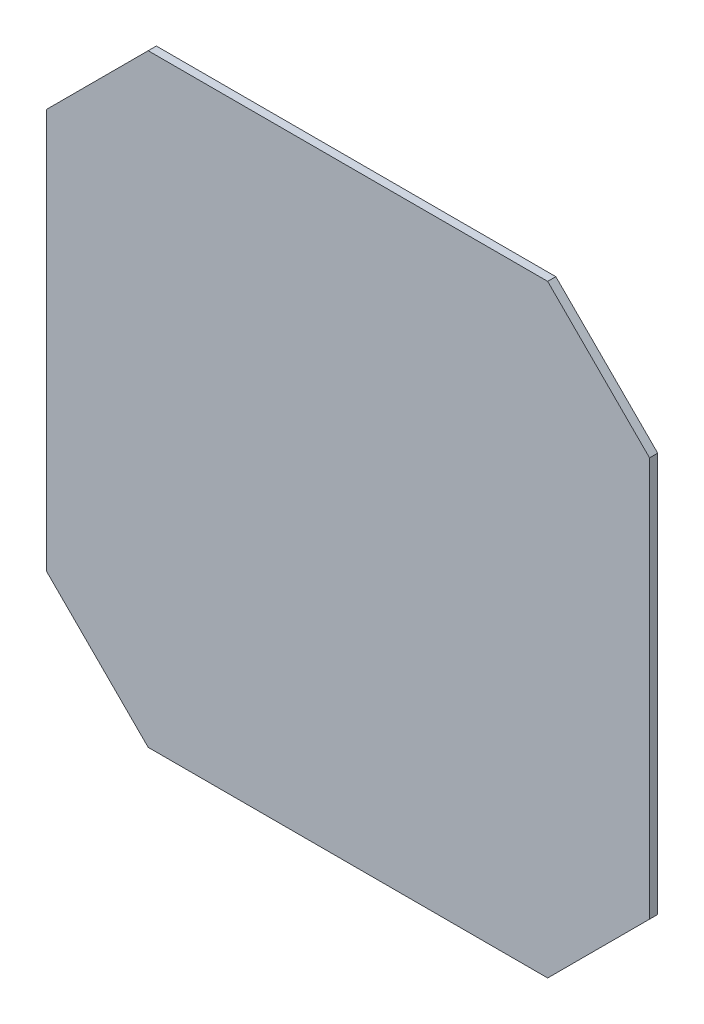
ISO-10303-21;
HEADER;
FILE_DESCRIPTION(('STEP AP214'),'2;1');
FILE_NAME('part.step','',(''),(''),'','','');
FILE_SCHEMA(('AUTOMOTIVE_DESIGN { 1 0 10303 214 1 1 1 1 }'));
ENDSEC;
DATA;
#1=APPLICATION_CONTEXT('core data for automotive mechanical design processes');
#2=APPLICATION_PROTOCOL_DEFINITION('international standard','automotive_design',2000,#1);
#3=PRODUCT_CONTEXT('',#1,'mechanical');
#4=PRODUCT('Part','Part','',(#3));
#5=PRODUCT_RELATED_PRODUCT_CATEGORY('part','',(#4));
#6=PRODUCT_DEFINITION_FORMATION('','',#4);
#7=PRODUCT_DEFINITION_CONTEXT('part definition',#1,'design');
#8=PRODUCT_DEFINITION('design','',#6,#7);
#9=PRODUCT_DEFINITION_SHAPE('','',#8);
#10=(LENGTH_UNIT() NAMED_UNIT(*) SI_UNIT(.MILLI.,.METRE.));
#11=(NAMED_UNIT(*) PLANE_ANGLE_UNIT() SI_UNIT($,.RADIAN.));
#12=(NAMED_UNIT(*) SI_UNIT($,.STERADIAN.) SOLID_ANGLE_UNIT());
#13=UNCERTAINTY_MEASURE_WITH_UNIT(LENGTH_MEASURE(1.E-05),#10,'distance_accuracy_value','');
#14=(GEOMETRIC_REPRESENTATION_CONTEXT(3) GLOBAL_UNCERTAINTY_ASSIGNED_CONTEXT((#13)) GLOBAL_UNIT_ASSIGNED_CONTEXT((#10,
#11,#12)) REPRESENTATION_CONTEXT('',''));
#15=CARTESIAN_POINT('',(0.,0.,0.));
#16=DIRECTION('',(0.,0.,1.));
#17=DIRECTION('',(1.,0.,0.));
#18=AXIS2_PLACEMENT_3D('',#15,#16,#17);
#19=CARTESIAN_POINT('',(-74.,-49.,2.));
#20=DIRECTION('',(1.,0.,0.));
#21=DIRECTION('',(0.,0.,-1.));
#22=AXIS2_PLACEMENT_3D('',#19,#20,#21);
#23=PLANE('',#22);
#24=DIRECTION('',(0.,-1.,0.));
#25=VECTOR('',#24,1.);
#26=CARTESIAN_POINT('',(-74.,-49.,0.));
#27=LINE('',#26,#25);
#28=CARTESIAN_POINT('',(-74.,49.,0.));
#29=VERTEX_POINT('',#28);
#30=CARTESIAN_POINT('',(-74.,-49.,0.));
#31=VERTEX_POINT('',#30);
#32=EDGE_CURVE('E128',#29,#31,#27,.T.);
#33=ORIENTED_EDGE('',*,*,#32,.T.);
#34=DIRECTION('',(0.,0.,-1.));
#35=VECTOR('',#34,1.);
#36=CARTESIAN_POINT('',(-74.,-49.,2.));
#37=LINE('',#36,#35);
#38=CARTESIAN_POINT('',(-74.,-49.,2.));
#39=VERTEX_POINT('',#38);
#40=EDGE_CURVE('E11',#39,#31,#37,.T.);
#41=ORIENTED_EDGE('',*,*,#40,.F.);
#42=DIRECTION('',(0.,-1.,0.));
#43=VECTOR('',#42,1.);
#44=CARTESIAN_POINT('',(-74.,-49.,2.));
#45=LINE('',#44,#43);
#46=CARTESIAN_POINT('',(-74.,49.,2.));
#47=VERTEX_POINT('',#46);
#48=EDGE_CURVE('E142',#47,#39,#45,.T.);
#49=ORIENTED_EDGE('',*,*,#48,.F.);
#50=DIRECTION('',(0.,0.,-1.));
#51=VECTOR('',#50,1.);
#52=CARTESIAN_POINT('',(-74.,49.,2.));
#53=LINE('',#52,#51);
#54=EDGE_CURVE('E124',#47,#29,#53,.T.);
#55=ORIENTED_EDGE('',*,*,#54,.T.);
#56=EDGE_LOOP('',(#33,#41,#49,#55));
#57=FACE_BOUND('',#56,.T.);
#58=ADVANCED_FACE('F32',(#57),#23,.F.);
#59=CARTESIAN_POINT('',(-74.,-49.,2.));
#60=DIRECTION('',(0.707106781186547,0.707106781186547,0.));
#61=DIRECTION('',(-0.707106781186548,0.707106781186548,0.));
#62=AXIS2_PLACEMENT_3D('',#59,#60,#61);
#63=PLANE('',#62);
#64=DIRECTION('',(0.707106781186547,-0.707106781186547,0.));
#65=VECTOR('',#64,1.);
#66=CARTESIAN_POINT('',(-74.,-49.,0.));
#67=LINE('',#66,#65);
#68=CARTESIAN_POINT('',(-49.,-74.,0.));
#69=VERTEX_POINT('',#68);
#70=EDGE_CURVE('E131',#31,#69,#67,.T.);
#71=ORIENTED_EDGE('',*,*,#70,.T.);
#72=DIRECTION('',(0.,0.,-1.));
#73=VECTOR('',#72,1.);
#74=CARTESIAN_POINT('',(-49.,-74.,2.));
#75=LINE('',#74,#73);
#76=CARTESIAN_POINT('',(-49.,-74.,2.));
#77=VERTEX_POINT('',#76);
#78=EDGE_CURVE('E40',#77,#69,#75,.T.);
#79=ORIENTED_EDGE('',*,*,#78,.F.);
#80=DIRECTION('',(0.707106781186547,-0.707106781186547,0.));
#81=VECTOR('',#80,1.);
#82=CARTESIAN_POINT('',(-74.,-49.,2.));
#83=LINE('',#82,#81);
#84=EDGE_CURVE('E91',#39,#77,#83,.T.);
#85=ORIENTED_EDGE('',*,*,#84,.F.);
#86=ORIENTED_EDGE('',*,*,#40,.T.);
#87=EDGE_LOOP('',(#71,#79,#85,#86));
#88=FACE_BOUND('',#87,.T.);
#89=ADVANCED_FACE('F177',(#88),#63,.F.);
#90=CARTESIAN_POINT('',(-49.,-74.,2.));
#91=DIRECTION('',(0.,1.,0.));
#92=DIRECTION('',(0.,0.,1.));
#93=AXIS2_PLACEMENT_3D('',#90,#91,#92);
#94=PLANE('',#93);
#95=DIRECTION('',(1.,0.,0.));
#96=VECTOR('',#95,1.);
#97=CARTESIAN_POINT('',(-49.,-74.,0.));
#98=LINE('',#97,#96);
#99=CARTESIAN_POINT('',(49.,-74.,0.));
#100=VERTEX_POINT('',#99);
#101=EDGE_CURVE('E133',#69,#100,#98,.T.);
#102=ORIENTED_EDGE('',*,*,#101,.T.);
#103=DIRECTION('',(0.,0.,-1.));
#104=VECTOR('',#103,1.);
#105=CARTESIAN_POINT('',(49.,-74.,2.));
#106=LINE('',#105,#104);
#107=CARTESIAN_POINT('',(49.,-74.,2.));
#108=VERTEX_POINT('',#107);
#109=EDGE_CURVE('E149',#108,#100,#106,.T.);
#110=ORIENTED_EDGE('',*,*,#109,.F.);
#111=DIRECTION('',(1.,0.,0.));
#112=VECTOR('',#111,1.);
#113=CARTESIAN_POINT('',(-49.,-74.,2.));
#114=LINE('',#113,#112);
#115=EDGE_CURVE('E157',#77,#108,#114,.T.);
#116=ORIENTED_EDGE('',*,*,#115,.F.);
#117=ORIENTED_EDGE('',*,*,#78,.T.);
#118=EDGE_LOOP('',(#102,#110,#116,#117));
#119=FACE_BOUND('',#118,.T.);
#120=ADVANCED_FACE('F155',(#119),#94,.F.);
#121=CARTESIAN_POINT('',(49.,-74.,2.));
#122=DIRECTION('',(-0.707106781186547,0.707106781186547,0.));
#123=DIRECTION('',(-0.707106781186548,-0.707106781186548,0.));
#124=AXIS2_PLACEMENT_3D('',#121,#122,#123);
#125=PLANE('',#124);
#126=DIRECTION('',(0.707106781186547,0.707106781186547,0.));
#127=VECTOR('',#126,1.);
#128=CARTESIAN_POINT('',(49.,-74.,0.));
#129=LINE('',#128,#127);
#130=CARTESIAN_POINT('',(74.,-49.,0.));
#131=VERTEX_POINT('',#130);
#132=EDGE_CURVE('E135',#100,#131,#129,.T.);
#133=ORIENTED_EDGE('',*,*,#132,.T.);
#134=DIRECTION('',(0.,0.,-1.));
#135=VECTOR('',#134,1.);
#136=CARTESIAN_POINT('',(74.,-49.,2.));
#137=LINE('',#136,#135);
#138=CARTESIAN_POINT('',(74.,-49.,2.));
#139=VERTEX_POINT('',#138);
#140=EDGE_CURVE('E146',#139,#131,#137,.T.);
#141=ORIENTED_EDGE('',*,*,#140,.F.);
#142=DIRECTION('',(0.707106781186547,0.707106781186547,0.));
#143=VECTOR('',#142,1.);
#144=CARTESIAN_POINT('',(49.,-74.,2.));
#145=LINE('',#144,#143);
#146=EDGE_CURVE('E169',#108,#139,#145,.T.);
#147=ORIENTED_EDGE('',*,*,#146,.F.);
#148=ORIENTED_EDGE('',*,*,#109,.T.);
#149=EDGE_LOOP('',(#133,#141,#147,#148));
#150=FACE_BOUND('',#149,.T.);
#151=ADVANCED_FACE('F165',(#150),#125,.F.);
#152=CARTESIAN_POINT('',(74.,-49.,2.));
#153=DIRECTION('',(-1.,0.,0.));
#154=DIRECTION('',(0.,0.,1.));
#155=AXIS2_PLACEMENT_3D('',#152,#153,#154);
#156=PLANE('',#155);
#157=DIRECTION('',(0.,1.,0.));
#158=VECTOR('',#157,1.);
#159=CARTESIAN_POINT('',(74.,-49.,0.));
#160=LINE('',#159,#158);
#161=CARTESIAN_POINT('',(74.,49.,0.));
#162=VERTEX_POINT('',#161);
#163=EDGE_CURVE('E137',#131,#162,#160,.T.);
#164=ORIENTED_EDGE('',*,*,#163,.T.);
#165=DIRECTION('',(0.,0.,-1.));
#166=VECTOR('',#165,1.);
#167=CARTESIAN_POINT('',(74.,49.,2.));
#168=LINE('',#167,#166);
#169=CARTESIAN_POINT('',(74.,49.,2.));
#170=VERTEX_POINT('',#169);
#171=EDGE_CURVE('E119',#170,#162,#168,.T.);
#172=ORIENTED_EDGE('',*,*,#171,.F.);
#173=DIRECTION('',(0.,1.,0.));
#174=VECTOR('',#173,1.);
#175=CARTESIAN_POINT('',(74.,-49.,2.));
#176=LINE('',#175,#174);
#177=EDGE_CURVE('E110',#139,#170,#176,.T.);
#178=ORIENTED_EDGE('',*,*,#177,.F.);
#179=ORIENTED_EDGE('',*,*,#140,.T.);
#180=EDGE_LOOP('',(#164,#172,#178,#179));
#181=FACE_BOUND('',#180,.T.);
#182=ADVANCED_FACE('F168',(#181),#156,.F.);
#183=CARTESIAN_POINT('',(49.,74.,2.));
#184=DIRECTION('',(-0.707106781186547,-0.707106781186547,0.));
#185=DIRECTION('',(0.707106781186548,-0.707106781186548,0.));
#186=AXIS2_PLACEMENT_3D('',#183,#184,#185);
#187=PLANE('',#186);
#188=DIRECTION('',(-0.707106781186547,0.707106781186547,0.));
#189=VECTOR('',#188,1.);
#190=CARTESIAN_POINT('',(49.,74.,0.));
#191=LINE('',#190,#189);
#192=CARTESIAN_POINT('',(49.,74.,0.));
#193=VERTEX_POINT('',#192);
#194=EDGE_CURVE('E118',#162,#193,#191,.T.);
#195=ORIENTED_EDGE('',*,*,#194,.T.);
#196=DIRECTION('',(0.,0.,-1.));
#197=VECTOR('',#196,1.);
#198=CARTESIAN_POINT('',(49.,74.,2.));
#199=LINE('',#198,#197);
#200=CARTESIAN_POINT('',(49.,74.,2.));
#201=VERTEX_POINT('',#200);
#202=EDGE_CURVE('E115',#201,#193,#199,.T.);
#203=ORIENTED_EDGE('',*,*,#202,.F.);
#204=DIRECTION('',(-0.707106781186547,0.707106781186547,0.));
#205=VECTOR('',#204,1.);
#206=CARTESIAN_POINT('',(49.,74.,2.));
#207=LINE('',#206,#205);
#208=EDGE_CURVE('E104',#170,#201,#207,.T.);
#209=ORIENTED_EDGE('',*,*,#208,.F.);
#210=ORIENTED_EDGE('',*,*,#171,.T.);
#211=EDGE_LOOP('',(#195,#203,#209,#210));
#212=FACE_BOUND('',#211,.T.);
#213=ADVANCED_FACE('F116',(#212),#187,.F.);
#214=CARTESIAN_POINT('',(-49.,74.,2.));
#215=DIRECTION('',(0.,-1.,0.));
#216=DIRECTION('',(0.,0.,-1.));
#217=AXIS2_PLACEMENT_3D('',#214,#215,#216);
#218=PLANE('',#217);
#219=DIRECTION('',(-1.,0.,0.));
#220=VECTOR('',#219,1.);
#221=CARTESIAN_POINT('',(-49.,74.,0.));
#222=LINE('',#221,#220);
#223=CARTESIAN_POINT('',(-49.,74.,0.));
#224=VERTEX_POINT('',#223);
#225=EDGE_CURVE('E77',#193,#224,#222,.T.);
#226=ORIENTED_EDGE('',*,*,#225,.T.);
#227=DIRECTION('',(0.,0.,-1.));
#228=VECTOR('',#227,1.);
#229=CARTESIAN_POINT('',(-49.,74.,2.));
#230=LINE('',#229,#228);
#231=CARTESIAN_POINT('',(-49.,74.,2.));
#232=VERTEX_POINT('',#231);
#233=EDGE_CURVE('E120',#232,#224,#230,.T.);
#234=ORIENTED_EDGE('',*,*,#233,.F.);
#235=DIRECTION('',(-1.,0.,0.));
#236=VECTOR('',#235,1.);
#237=CARTESIAN_POINT('',(-49.,74.,2.));
#238=LINE('',#237,#236);
#239=EDGE_CURVE('E108',#201,#232,#238,.T.);
#240=ORIENTED_EDGE('',*,*,#239,.F.);
#241=ORIENTED_EDGE('',*,*,#202,.T.);
#242=EDGE_LOOP('',(#226,#234,#240,#241));
#243=FACE_BOUND('',#242,.T.);
#244=ADVANCED_FACE('F122',(#243),#218,.F.);
#245=CARTESIAN_POINT('',(-74.,49.,2.));
#246=DIRECTION('',(0.707106781186547,-0.707106781186547,0.));
#247=DIRECTION('',(0.707106781186548,0.707106781186548,0.));
#248=AXIS2_PLACEMENT_3D('',#245,#246,#247);
#249=PLANE('',#248);
#250=DIRECTION('',(-0.707106781186547,-0.707106781186547,0.));
#251=VECTOR('',#250,1.);
#252=CARTESIAN_POINT('',(-74.,49.,0.));
#253=LINE('',#252,#251);
#254=EDGE_CURVE('E83',#224,#29,#253,.T.);
#255=ORIENTED_EDGE('',*,*,#254,.T.);
#256=ORIENTED_EDGE('',*,*,#54,.F.);
#257=DIRECTION('',(-0.707106781186547,-0.707106781186547,0.));
#258=VECTOR('',#257,1.);
#259=CARTESIAN_POINT('',(-74.,49.,2.));
#260=LINE('',#259,#258);
#261=EDGE_CURVE('E48',#232,#47,#260,.T.);
#262=ORIENTED_EDGE('',*,*,#261,.F.);
#263=ORIENTED_EDGE('',*,*,#233,.T.);
#264=EDGE_LOOP('',(#255,#256,#262,#263));
#265=FACE_BOUND('',#264,.T.);
#266=ADVANCED_FACE('F193',(#265),#249,.F.);
#267=CARTESIAN_POINT('',(0.,0.,2.));
#268=DIRECTION('',(0.,0.,-1.));
#269=DIRECTION('',(-1.,0.,0.));
#270=AXIS2_PLACEMENT_3D('',#267,#268,#269);
#271=PLANE('',#270);
#272=ORIENTED_EDGE('',*,*,#48,.T.);
#273=ORIENTED_EDGE('',*,*,#84,.T.);
#274=ORIENTED_EDGE('',*,*,#115,.T.);
#275=ORIENTED_EDGE('',*,*,#146,.T.);
#276=ORIENTED_EDGE('',*,*,#177,.T.);
#277=ORIENTED_EDGE('',*,*,#208,.T.);
#278=ORIENTED_EDGE('',*,*,#239,.T.);
#279=ORIENTED_EDGE('',*,*,#261,.T.);
#280=EDGE_LOOP('',(#272,#273,#274,#275,#276,#277,#278,#279));
#281=FACE_BOUND('',#280,.T.);
#282=ADVANCED_FACE('F106',(#281),#271,.F.);
#283=CARTESIAN_POINT('',(0.,0.,0.));
#284=DIRECTION('',(0.,0.,-1.));
#285=DIRECTION('',(-1.,0.,0.));
#286=AXIS2_PLACEMENT_3D('',#283,#284,#285);
#287=PLANE('',#286);
#288=ORIENTED_EDGE('',*,*,#32,.F.);
#289=ORIENTED_EDGE('',*,*,#254,.F.);
#290=ORIENTED_EDGE('',*,*,#225,.F.);
#291=ORIENTED_EDGE('',*,*,#194,.F.);
#292=ORIENTED_EDGE('',*,*,#163,.F.);
#293=ORIENTED_EDGE('',*,*,#132,.F.);
#294=ORIENTED_EDGE('',*,*,#101,.F.);
#295=ORIENTED_EDGE('',*,*,#70,.F.);
#296=EDGE_LOOP('',(#288,#289,#290,#291,#292,#293,#294,#295));
#297=FACE_BOUND('',#296,.T.);
#298=ADVANCED_FACE('F161',(#297),#287,.T.);
#299=CLOSED_SHELL('',(#58,#89,#120,#151,#182,#213,#244,#266,#282,#298));
#300=MANIFOLD_SOLID_BREP('B2',#299);
#301=ADVANCED_BREP_SHAPE_REPRESENTATION('',(#18,#300),#14);
#302=SHAPE_DEFINITION_REPRESENTATION(#9,#301);
ENDSEC;
END-ISO-10303-21;
